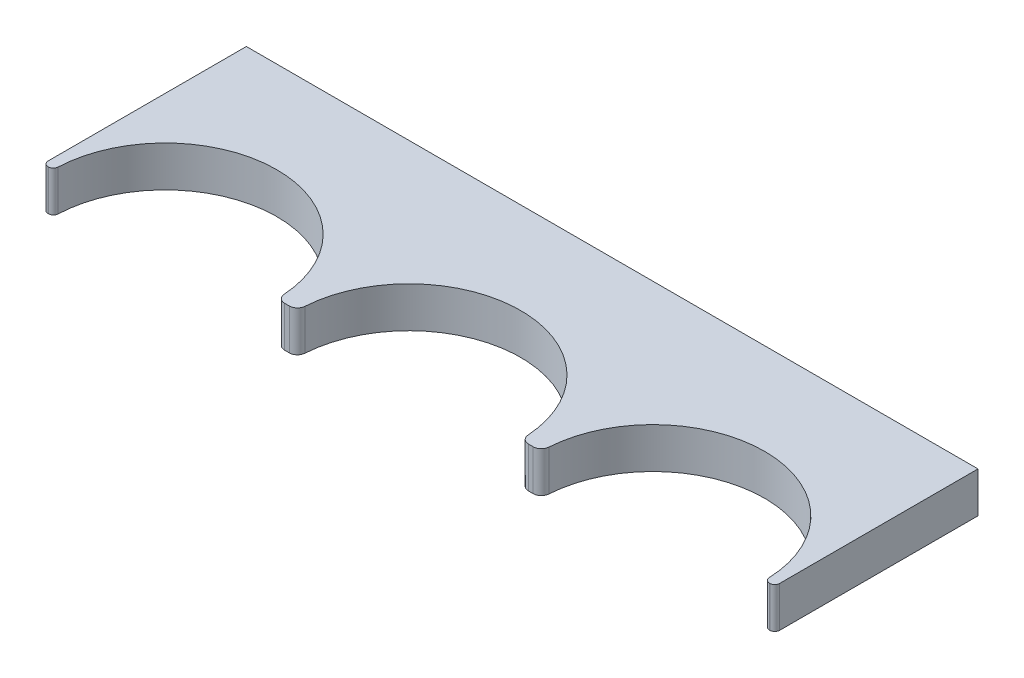
ISO-10303-21;
HEADER;
FILE_DESCRIPTION(('STEP AP214'),'2;1');
FILE_NAME('part.step','',(''),(''),'','','');
FILE_SCHEMA(('AUTOMOTIVE_DESIGN { 1 0 10303 214 1 1 1 1 }'));
ENDSEC;
DATA;
#1=APPLICATION_CONTEXT('core data for automotive mechanical design processes');
#2=APPLICATION_PROTOCOL_DEFINITION('international standard','automotive_design',2000,#1);
#3=PRODUCT_CONTEXT('',#1,'mechanical');
#4=PRODUCT('Part','Part','',(#3));
#5=PRODUCT_RELATED_PRODUCT_CATEGORY('part','',(#4));
#6=PRODUCT_DEFINITION_FORMATION('','',#4);
#7=PRODUCT_DEFINITION_CONTEXT('part definition',#1,'design');
#8=PRODUCT_DEFINITION('design','',#6,#7);
#9=PRODUCT_DEFINITION_SHAPE('','',#8);
#10=(LENGTH_UNIT() NAMED_UNIT(*) SI_UNIT(.MILLI.,.METRE.));
#11=(NAMED_UNIT(*) PLANE_ANGLE_UNIT() SI_UNIT($,.RADIAN.));
#12=(NAMED_UNIT(*) SI_UNIT($,.STERADIAN.) SOLID_ANGLE_UNIT());
#13=UNCERTAINTY_MEASURE_WITH_UNIT(LENGTH_MEASURE(1.E-05),#10,'distance_accuracy_value','');
#14=(GEOMETRIC_REPRESENTATION_CONTEXT(3) GLOBAL_UNCERTAINTY_ASSIGNED_CONTEXT((#13)) GLOBAL_UNIT_ASSIGNED_CONTEXT((#10,
#11,#12)) REPRESENTATION_CONTEXT('',''));
#15=CARTESIAN_POINT('',(0.,0.,0.));
#16=DIRECTION('',(0.,0.,1.));
#17=DIRECTION('',(1.,0.,0.));
#18=AXIS2_PLACEMENT_3D('',#15,#16,#17);
#19=CARTESIAN_POINT('',(-60.,10.,25.));
#20=DIRECTION('',(0.,-1.,0.));
#21=DIRECTION('',(0.,0.,-1.));
#22=AXIS2_PLACEMENT_3D('',#19,#20,#21);
#23=CYLINDRICAL_SURFACE('',#22,27.5);
#24=CARTESIAN_POINT('',(-60.,0.,25.));
#25=DIRECTION('',(0.,1.,0.));
#26=DIRECTION('',(0.,0.,1.));
#27=AXIS2_PLACEMENT_3D('',#24,#25,#26);
#28=CIRCLE('',#27,27.5);
#29=CARTESIAN_POINT('',(-32.5632730202753,0.,23.135593220339));
#30=VERTEX_POINT('',#29);
#31=CARTESIAN_POINT('',(-87.4759513150411,0.,23.8501742160279));
#32=VERTEX_POINT('',#31);
#33=EDGE_CURVE('E187',#30,#32,#28,.T.);
#34=ORIENTED_EDGE('',*,*,#33,.F.);
#35=DIRECTION('',(0.,-1.,0.));
#36=VECTOR('',#35,1.);
#37=CARTESIAN_POINT('',(-32.5632730202753,10.,23.135593220339));
#38=LINE('',#37,#36);
#39=CARTESIAN_POINT('',(-32.5632730202753,10.,23.135593220339));
#40=VERTEX_POINT('',#39);
#41=EDGE_CURVE('E11',#40,#30,#38,.T.);
#42=ORIENTED_EDGE('',*,*,#41,.F.);
#43=CARTESIAN_POINT('',(-60.,10.,25.));
#44=DIRECTION('',(0.,1.,0.));
#45=DIRECTION('',(0.,0.,1.));
#46=AXIS2_PLACEMENT_3D('',#43,#44,#45);
#47=CIRCLE('',#46,27.5);
#48=CARTESIAN_POINT('',(-87.4759513150411,10.,23.8501742160279));
#49=VERTEX_POINT('',#48);
#50=EDGE_CURVE('E235',#40,#49,#47,.T.);
#51=ORIENTED_EDGE('',*,*,#50,.T.);
#52=DIRECTION('',(0.,-1.,0.));
#53=VECTOR('',#52,1.);
#54=CARTESIAN_POINT('',(-87.4759513150411,10.,23.8501742160279));
#55=LINE('',#54,#53);
#56=EDGE_CURVE('E114',#49,#32,#55,.T.);
#57=ORIENTED_EDGE('',*,*,#56,.T.);
#58=EDGE_LOOP('',(#34,#42,#51,#57));
#59=FACE_BOUND('',#58,.T.);
#60=ADVANCED_FACE('F34',(#59),#23,.F.);
#61=CARTESIAN_POINT('',(-30.5678746944771,10.,23.));
#62=DIRECTION('',(0.,-1.,0.));
#63=DIRECTION('',(0.,0.,-1.));
#64=AXIS2_PLACEMENT_3D('',#61,#62,#63);
#65=CYLINDRICAL_SURFACE('',#64,2.);
#66=CARTESIAN_POINT('',(-30.5678746944771,0.,23.));
#67=DIRECTION('',(0.,1.,0.));
#68=DIRECTION('',(0.,0.,1.));
#69=AXIS2_PLACEMENT_3D('',#66,#67,#68);
#70=CIRCLE('',#69,2.);
#71=CARTESIAN_POINT('',(-30.5678746944771,0.,25.));
#72=VERTEX_POINT('',#71);
#73=EDGE_CURVE('E190',#30,#72,#70,.T.);
#74=ORIENTED_EDGE('',*,*,#73,.T.);
#75=DIRECTION('',(0.,-1.,0.));
#76=VECTOR('',#75,1.);
#77=CARTESIAN_POINT('',(-30.5678746944771,10.,25.));
#78=LINE('',#77,#76);
#79=CARTESIAN_POINT('',(-30.5678746944771,10.,25.));
#80=VERTEX_POINT('',#79);
#81=EDGE_CURVE('E42',#80,#72,#78,.T.);
#82=ORIENTED_EDGE('',*,*,#81,.F.);
#83=CARTESIAN_POINT('',(-30.5678746944771,10.,23.));
#84=DIRECTION('',(0.,1.,0.));
#85=DIRECTION('',(0.,0.,1.));
#86=AXIS2_PLACEMENT_3D('',#83,#84,#85);
#87=CIRCLE('',#86,2.);
#88=EDGE_CURVE('E288',#40,#80,#87,.T.);
#89=ORIENTED_EDGE('',*,*,#88,.F.);
#90=ORIENTED_EDGE('',*,*,#41,.T.);
#91=EDGE_LOOP('',(#74,#82,#89,#90));
#92=FACE_BOUND('',#91,.T.);
#93=ADVANCED_FACE('F273',(#92),#65,.T.);
#94=CARTESIAN_POINT('',(0.,10.,25.));
#95=DIRECTION('',(0.,0.,1.));
#96=DIRECTION('',(1.,0.,0.));
#97=AXIS2_PLACEMENT_3D('',#94,#95,#96);
#98=PLANE('',#97);
#99=DIRECTION('',(-1.,0.,0.));
#100=VECTOR('',#99,1.);
#101=CARTESIAN_POINT('',(0.,0.,25.));
#102=LINE('',#101,#100);
#103=CARTESIAN_POINT('',(-29.4321253055229,0.,25.));
#104=VERTEX_POINT('',#103);
#105=EDGE_CURVE('E193',#104,#72,#102,.T.);
#106=ORIENTED_EDGE('',*,*,#105,.F.);
#107=DIRECTION('',(0.,-1.,0.));
#108=VECTOR('',#107,1.);
#109=CARTESIAN_POINT('',(-29.4321253055229,10.,25.));
#110=LINE('',#109,#108);
#111=CARTESIAN_POINT('',(-29.4321253055229,10.,25.));
#112=VERTEX_POINT('',#111);
#113=EDGE_CURVE('E263',#112,#104,#110,.T.);
#114=ORIENTED_EDGE('',*,*,#113,.F.);
#115=DIRECTION('',(-1.,0.,0.));
#116=VECTOR('',#115,1.);
#117=CARTESIAN_POINT('',(0.,10.,25.));
#118=LINE('',#117,#116);
#119=EDGE_CURVE('E270',#112,#80,#118,.T.);
#120=ORIENTED_EDGE('',*,*,#119,.T.);
#121=ORIENTED_EDGE('',*,*,#81,.T.);
#122=EDGE_LOOP('',(#106,#114,#120,#121));
#123=FACE_BOUND('',#122,.T.);
#124=ADVANCED_FACE('F268',(#123),#98,.T.);
#125=CARTESIAN_POINT('',(-29.4321253055229,10.,23.));
#126=DIRECTION('',(0.,-1.,0.));
#127=DIRECTION('',(0.,0.,-1.));
#128=AXIS2_PLACEMENT_3D('',#125,#126,#127);
#129=CYLINDRICAL_SURFACE('',#128,2.);
#130=CARTESIAN_POINT('',(-29.4321253055229,0.,23.));
#131=DIRECTION('',(0.,1.,0.));
#132=DIRECTION('',(0.,0.,1.));
#133=AXIS2_PLACEMENT_3D('',#130,#131,#132);
#134=CIRCLE('',#133,2.);
#135=CARTESIAN_POINT('',(-27.4367269797247,0.,23.135593220339));
#136=VERTEX_POINT('',#135);
#137=EDGE_CURVE('E196',#104,#136,#134,.T.);
#138=ORIENTED_EDGE('',*,*,#137,.T.);
#139=DIRECTION('',(0.,-1.,0.));
#140=VECTOR('',#139,1.);
#141=CARTESIAN_POINT('',(-27.4367269797247,10.,23.135593220339));
#142=LINE('',#141,#140);
#143=CARTESIAN_POINT('',(-27.4367269797247,10.,23.135593220339));
#144=VERTEX_POINT('',#143);
#145=EDGE_CURVE('E261',#144,#136,#142,.T.);
#146=ORIENTED_EDGE('',*,*,#145,.F.);
#147=CARTESIAN_POINT('',(-29.4321253055229,10.,23.));
#148=DIRECTION('',(0.,1.,0.));
#149=DIRECTION('',(0.,0.,1.));
#150=AXIS2_PLACEMENT_3D('',#147,#148,#149);
#151=CIRCLE('',#150,2.);
#152=EDGE_CURVE('E284',#112,#144,#151,.T.);
#153=ORIENTED_EDGE('',*,*,#152,.F.);
#154=ORIENTED_EDGE('',*,*,#113,.T.);
#155=EDGE_LOOP('',(#138,#146,#153,#154));
#156=FACE_BOUND('',#155,.T.);
#157=ADVANCED_FACE('F281',(#156),#129,.T.);
#158=CARTESIAN_POINT('',(0.,10.,25.));
#159=DIRECTION('',(0.,-1.,0.));
#160=DIRECTION('',(0.,0.,-1.));
#161=AXIS2_PLACEMENT_3D('',#158,#159,#160);
#162=CYLINDRICAL_SURFACE('',#161,27.5);
#163=CARTESIAN_POINT('',(0.,0.,25.));
#164=DIRECTION('',(0.,1.,0.));
#165=DIRECTION('',(0.,0.,1.));
#166=AXIS2_PLACEMENT_3D('',#163,#164,#165);
#167=CIRCLE('',#166,27.5);
#168=CARTESIAN_POINT('',(27.4367269797247,0.,23.135593220339));
#169=VERTEX_POINT('',#168);
#170=EDGE_CURVE('E199',#169,#136,#167,.T.);
#171=ORIENTED_EDGE('',*,*,#170,.F.);
#172=DIRECTION('',(0.,-1.,0.));
#173=VECTOR('',#172,1.);
#174=CARTESIAN_POINT('',(27.4367269797247,10.,23.135593220339));
#175=LINE('',#174,#173);
#176=CARTESIAN_POINT('',(27.4367269797247,10.,23.135593220339));
#177=VERTEX_POINT('',#176);
#178=EDGE_CURVE('E259',#177,#169,#175,.T.);
#179=ORIENTED_EDGE('',*,*,#178,.F.);
#180=CARTESIAN_POINT('',(0.,10.,25.));
#181=DIRECTION('',(0.,1.,0.));
#182=DIRECTION('',(0.,0.,1.));
#183=AXIS2_PLACEMENT_3D('',#180,#181,#182);
#184=CIRCLE('',#183,27.5);
#185=EDGE_CURVE('E286',#177,#144,#184,.T.);
#186=ORIENTED_EDGE('',*,*,#185,.T.);
#187=ORIENTED_EDGE('',*,*,#145,.T.);
#188=EDGE_LOOP('',(#171,#179,#186,#187));
#189=FACE_BOUND('',#188,.T.);
#190=ADVANCED_FACE('F332',(#189),#162,.F.);
#191=CARTESIAN_POINT('',(29.4321253055229,10.,23.));
#192=DIRECTION('',(0.,-1.,0.));
#193=DIRECTION('',(0.,0.,-1.));
#194=AXIS2_PLACEMENT_3D('',#191,#192,#193);
#195=CYLINDRICAL_SURFACE('',#194,2.);
#196=CARTESIAN_POINT('',(29.4321253055229,0.,23.));
#197=DIRECTION('',(0.,1.,0.));
#198=DIRECTION('',(0.,0.,1.));
#199=AXIS2_PLACEMENT_3D('',#196,#197,#198);
#200=CIRCLE('',#199,2.);
#201=CARTESIAN_POINT('',(29.4321253055229,0.,25.));
#202=VERTEX_POINT('',#201);
#203=EDGE_CURVE('E202',#169,#202,#200,.T.);
#204=ORIENTED_EDGE('',*,*,#203,.T.);
#205=DIRECTION('',(0.,-1.,0.));
#206=VECTOR('',#205,1.);
#207=CARTESIAN_POINT('',(29.4321253055229,10.,25.));
#208=LINE('',#207,#206);
#209=CARTESIAN_POINT('',(29.4321253055229,10.,25.));
#210=VERTEX_POINT('',#209);
#211=EDGE_CURVE('E257',#210,#202,#208,.T.);
#212=ORIENTED_EDGE('',*,*,#211,.F.);
#213=CARTESIAN_POINT('',(29.4321253055229,10.,23.));
#214=DIRECTION('',(0.,1.,0.));
#215=DIRECTION('',(0.,0.,1.));
#216=AXIS2_PLACEMENT_3D('',#213,#214,#215);
#217=CIRCLE('',#216,2.);
#218=EDGE_CURVE('E294',#177,#210,#217,.T.);
#219=ORIENTED_EDGE('',*,*,#218,.F.);
#220=ORIENTED_EDGE('',*,*,#178,.T.);
#221=EDGE_LOOP('',(#204,#212,#219,#220));
#222=FACE_BOUND('',#221,.T.);
#223=ADVANCED_FACE('F335',(#222),#195,.T.);
#224=CARTESIAN_POINT('',(0.,10.,25.));
#225=DIRECTION('',(0.,0.,1.));
#226=DIRECTION('',(1.,0.,0.));
#227=AXIS2_PLACEMENT_3D('',#224,#225,#226);
#228=PLANE('',#227);
#229=DIRECTION('',(-1.,0.,0.));
#230=VECTOR('',#229,1.);
#231=CARTESIAN_POINT('',(0.,0.,25.));
#232=LINE('',#231,#230);
#233=CARTESIAN_POINT('',(30.5678746944771,0.,25.));
#234=VERTEX_POINT('',#233);
#235=EDGE_CURVE('E205',#234,#202,#232,.T.);
#236=ORIENTED_EDGE('',*,*,#235,.F.);
#237=DIRECTION('',(0.,-1.,0.));
#238=VECTOR('',#237,1.);
#239=CARTESIAN_POINT('',(30.5678746944771,10.,25.));
#240=LINE('',#239,#238);
#241=CARTESIAN_POINT('',(30.5678746944771,10.,25.));
#242=VERTEX_POINT('',#241);
#243=EDGE_CURVE('E255',#242,#234,#240,.T.);
#244=ORIENTED_EDGE('',*,*,#243,.F.);
#245=DIRECTION('',(-1.,0.,0.));
#246=VECTOR('',#245,1.);
#247=CARTESIAN_POINT('',(0.,10.,25.));
#248=LINE('',#247,#246);
#249=EDGE_CURVE('E296',#242,#210,#248,.T.);
#250=ORIENTED_EDGE('',*,*,#249,.T.);
#251=ORIENTED_EDGE('',*,*,#211,.T.);
#252=EDGE_LOOP('',(#236,#244,#250,#251));
#253=FACE_BOUND('',#252,.T.);
#254=ADVANCED_FACE('F339',(#253),#228,.T.);
#255=CARTESIAN_POINT('',(30.5678746944771,10.,23.));
#256=DIRECTION('',(0.,-1.,0.));
#257=DIRECTION('',(0.,0.,-1.));
#258=AXIS2_PLACEMENT_3D('',#255,#256,#257);
#259=CYLINDRICAL_SURFACE('',#258,2.);
#260=CARTESIAN_POINT('',(30.5678746944771,0.,23.));
#261=DIRECTION('',(0.,1.,0.));
#262=DIRECTION('',(0.,0.,1.));
#263=AXIS2_PLACEMENT_3D('',#260,#261,#262);
#264=CIRCLE('',#263,2.);
#265=CARTESIAN_POINT('',(32.5632730202753,0.,23.135593220339));
#266=VERTEX_POINT('',#265);
#267=EDGE_CURVE('E208',#234,#266,#264,.T.);
#268=ORIENTED_EDGE('',*,*,#267,.T.);
#269=DIRECTION('',(0.,-1.,0.));
#270=VECTOR('',#269,1.);
#271=CARTESIAN_POINT('',(32.5632730202753,10.,23.135593220339));
#272=LINE('',#271,#270);
#273=CARTESIAN_POINT('',(32.5632730202753,10.,23.135593220339));
#274=VERTEX_POINT('',#273);
#275=EDGE_CURVE('E253',#274,#266,#272,.T.);
#276=ORIENTED_EDGE('',*,*,#275,.F.);
#277=CARTESIAN_POINT('',(30.5678746944771,10.,23.));
#278=DIRECTION('',(0.,1.,0.));
#279=DIRECTION('',(0.,0.,1.));
#280=AXIS2_PLACEMENT_3D('',#277,#278,#279);
#281=CIRCLE('',#280,2.);
#282=EDGE_CURVE('E299',#242,#274,#281,.T.);
#283=ORIENTED_EDGE('',*,*,#282,.F.);
#284=ORIENTED_EDGE('',*,*,#243,.T.);
#285=EDGE_LOOP('',(#268,#276,#283,#284));
#286=FACE_BOUND('',#285,.T.);
#287=ADVANCED_FACE('F343',(#286),#259,.T.);
#288=CARTESIAN_POINT('',(60.,10.,25.));
#289=DIRECTION('',(0.,-1.,0.));
#290=DIRECTION('',(0.,0.,-1.));
#291=AXIS2_PLACEMENT_3D('',#288,#289,#290);
#292=CYLINDRICAL_SURFACE('',#291,27.5);
#293=CARTESIAN_POINT('',(60.,0.,25.));
#294=DIRECTION('',(0.,1.,0.));
#295=DIRECTION('',(0.,0.,1.));
#296=AXIS2_PLACEMENT_3D('',#293,#294,#295);
#297=CIRCLE('',#296,27.5);
#298=CARTESIAN_POINT('',(87.4759513150412,0.,23.8501742160279));
#299=VERTEX_POINT('',#298);
#300=EDGE_CURVE('E211',#299,#266,#297,.T.);
#301=ORIENTED_EDGE('',*,*,#300,.F.);
#302=DIRECTION('',(0.,-1.,0.));
#303=VECTOR('',#302,1.);
#304=CARTESIAN_POINT('',(87.4759513150412,10.,23.8501742160279));
#305=LINE('',#304,#303);
#306=CARTESIAN_POINT('',(87.4759513150412,10.,23.8501742160279));
#307=VERTEX_POINT('',#306);
#308=EDGE_CURVE('E251',#307,#299,#305,.T.);
#309=ORIENTED_EDGE('',*,*,#308,.F.);
#310=CARTESIAN_POINT('',(60.,10.,25.));
#311=DIRECTION('',(0.,1.,0.));
#312=DIRECTION('',(0.,0.,1.));
#313=AXIS2_PLACEMENT_3D('',#310,#311,#312);
#314=CIRCLE('',#313,27.5);
#315=EDGE_CURVE('E301',#307,#274,#314,.T.);
#316=ORIENTED_EDGE('',*,*,#315,.T.);
#317=ORIENTED_EDGE('',*,*,#275,.T.);
#318=EDGE_LOOP('',(#301,#309,#316,#317));
#319=FACE_BOUND('',#318,.T.);
#320=ADVANCED_FACE('F347',(#319),#292,.F.);
#321=CARTESIAN_POINT('',(88.6749019178793,10.,23.8));
#322=DIRECTION('',(0.,-1.,0.));
#323=DIRECTION('',(0.,0.,-1.));
#324=AXIS2_PLACEMENT_3D('',#321,#322,#323);
#325=CYLINDRICAL_SURFACE('',#324,1.2);
#326=CARTESIAN_POINT('',(88.6749019178793,0.,23.8));
#327=DIRECTION('',(0.,1.,0.));
#328=DIRECTION('',(0.,0.,1.));
#329=AXIS2_PLACEMENT_3D('',#326,#327,#328);
#330=CIRCLE('',#329,1.2);
#331=CARTESIAN_POINT('',(88.6749019178793,0.,25.));
#332=VERTEX_POINT('',#331);
#333=EDGE_CURVE('E214',#332,#299,#330,.F.);
#334=ORIENTED_EDGE('',*,*,#333,.F.);
#335=DIRECTION('',(0.,-1.,0.));
#336=VECTOR('',#335,1.);
#337=CARTESIAN_POINT('',(88.6749019178793,10.,25.));
#338=LINE('',#337,#336);
#339=CARTESIAN_POINT('',(88.6749019178793,10.,25.));
#340=VERTEX_POINT('',#339);
#341=EDGE_CURVE('E249',#340,#332,#338,.T.);
#342=ORIENTED_EDGE('',*,*,#341,.F.);
#343=CARTESIAN_POINT('',(88.6749019178793,10.,23.8));
#344=DIRECTION('',(0.,1.,0.));
#345=DIRECTION('',(0.,0.,1.));
#346=AXIS2_PLACEMENT_3D('',#343,#344,#345);
#347=CIRCLE('',#346,1.2);
#348=EDGE_CURVE('E304',#340,#307,#347,.F.);
#349=ORIENTED_EDGE('',*,*,#348,.T.);
#350=ORIENTED_EDGE('',*,*,#308,.T.);
#351=EDGE_LOOP('',(#334,#342,#349,#350));
#352=FACE_BOUND('',#351,.T.);
#353=ADVANCED_FACE('F351',(#352),#325,.T.);
#354=CARTESIAN_POINT('',(0.,10.,25.));
#355=DIRECTION('',(0.,0.,1.));
#356=DIRECTION('',(1.,0.,0.));
#357=AXIS2_PLACEMENT_3D('',#354,#355,#356);
#358=PLANE('',#357);
#359=DIRECTION('',(-1.,0.,0.));
#360=VECTOR('',#359,1.);
#361=CARTESIAN_POINT('',(0.,0.,25.));
#362=LINE('',#361,#360);
#363=CARTESIAN_POINT('',(88.8,0.,25.));
#364=VERTEX_POINT('',#363);
#365=EDGE_CURVE('E217',#364,#332,#362,.T.);
#366=ORIENTED_EDGE('',*,*,#365,.F.);
#367=DIRECTION('',(0.,-1.,0.));
#368=VECTOR('',#367,1.);
#369=CARTESIAN_POINT('',(88.8,10.,25.));
#370=LINE('',#369,#368);
#371=CARTESIAN_POINT('',(88.8,10.,25.));
#372=VERTEX_POINT('',#371);
#373=EDGE_CURVE('E247',#372,#364,#370,.T.);
#374=ORIENTED_EDGE('',*,*,#373,.F.);
#375=DIRECTION('',(-1.,0.,0.));
#376=VECTOR('',#375,1.);
#377=CARTESIAN_POINT('',(0.,10.,25.));
#378=LINE('',#377,#376);
#379=EDGE_CURVE('E307',#372,#340,#378,.T.);
#380=ORIENTED_EDGE('',*,*,#379,.T.);
#381=ORIENTED_EDGE('',*,*,#341,.T.);
#382=EDGE_LOOP('',(#366,#374,#380,#381));
#383=FACE_BOUND('',#382,.T.);
#384=ADVANCED_FACE('F355',(#383),#358,.T.);
#385=CARTESIAN_POINT('',(88.8,10.,23.8));
#386=DIRECTION('',(0.,-1.,0.));
#387=DIRECTION('',(0.,0.,-1.));
#388=AXIS2_PLACEMENT_3D('',#385,#386,#387);
#389=CYLINDRICAL_SURFACE('',#388,1.2);
#390=CARTESIAN_POINT('',(88.8,0.,23.8));
#391=DIRECTION('',(0.,1.,0.));
#392=DIRECTION('',(0.,0.,1.));
#393=AXIS2_PLACEMENT_3D('',#390,#391,#392);
#394=CIRCLE('',#393,1.2);
#395=CARTESIAN_POINT('',(90.,0.,23.8));
#396=VERTEX_POINT('',#395);
#397=EDGE_CURVE('E220',#364,#396,#394,.T.);
#398=ORIENTED_EDGE('',*,*,#397,.T.);
#399=DIRECTION('',(0.,-1.,0.));
#400=VECTOR('',#399,1.);
#401=CARTESIAN_POINT('',(90.,10.,23.8));
#402=LINE('',#401,#400);
#403=CARTESIAN_POINT('',(90.,10.,23.8));
#404=VERTEX_POINT('',#403);
#405=EDGE_CURVE('E244',#404,#396,#402,.T.);
#406=ORIENTED_EDGE('',*,*,#405,.F.);
#407=CARTESIAN_POINT('',(88.8,10.,23.8));
#408=DIRECTION('',(0.,1.,0.));
#409=DIRECTION('',(0.,0.,1.));
#410=AXIS2_PLACEMENT_3D('',#407,#408,#409);
#411=CIRCLE('',#410,1.2);
#412=EDGE_CURVE('E310',#372,#404,#411,.T.);
#413=ORIENTED_EDGE('',*,*,#412,.F.);
#414=ORIENTED_EDGE('',*,*,#373,.T.);
#415=EDGE_LOOP('',(#398,#406,#413,#414));
#416=FACE_BOUND('',#415,.T.);
#417=ADVANCED_FACE('F359',(#416),#389,.T.);
#418=CARTESIAN_POINT('',(90.,10.,0.));
#419=DIRECTION('',(-1.,0.,0.));
#420=DIRECTION('',(0.,0.,1.));
#421=AXIS2_PLACEMENT_3D('',#418,#419,#420);
#422=PLANE('',#421);
#423=DIRECTION('',(0.,0.,-1.));
#424=VECTOR('',#423,1.);
#425=CARTESIAN_POINT('',(90.,0.,0.));
#426=LINE('',#425,#424);
#427=CARTESIAN_POINT('',(90.,0.,-25.));
#428=VERTEX_POINT('',#427);
#429=EDGE_CURVE('E222',#396,#428,#426,.T.);
#430=ORIENTED_EDGE('',*,*,#429,.T.);
#431=DIRECTION('',(0.,-1.,0.));
#432=VECTOR('',#431,1.);
#433=CARTESIAN_POINT('',(90.,10.,-25.));
#434=LINE('',#433,#432);
#435=CARTESIAN_POINT('',(90.,10.,-25.));
#436=VERTEX_POINT('',#435);
#437=EDGE_CURVE('E241',#436,#428,#434,.T.);
#438=ORIENTED_EDGE('',*,*,#437,.F.);
#439=DIRECTION('',(0.,0.,-1.));
#440=VECTOR('',#439,1.);
#441=CARTESIAN_POINT('',(90.,10.,0.));
#442=LINE('',#441,#440);
#443=EDGE_CURVE('E312',#404,#436,#442,.T.);
#444=ORIENTED_EDGE('',*,*,#443,.F.);
#445=ORIENTED_EDGE('',*,*,#405,.T.);
#446=EDGE_LOOP('',(#430,#438,#444,#445));
#447=FACE_BOUND('',#446,.T.);
#448=ADVANCED_FACE('F363',(#447),#422,.F.);
#449=CARTESIAN_POINT('',(0.,10.,-25.));
#450=DIRECTION('',(0.,0.,1.));
#451=DIRECTION('',(1.,0.,0.));
#452=AXIS2_PLACEMENT_3D('',#449,#450,#451);
#453=PLANE('',#452);
#454=DIRECTION('',(-1.,0.,0.));
#455=VECTOR('',#454,1.);
#456=CARTESIAN_POINT('',(0.,0.,-25.));
#457=LINE('',#456,#455);
#458=CARTESIAN_POINT('',(-90.,0.,-25.));
#459=VERTEX_POINT('',#458);
#460=EDGE_CURVE('E224',#428,#459,#457,.T.);
#461=ORIENTED_EDGE('',*,*,#460,.T.);
#462=DIRECTION('',(0.,-1.,0.));
#463=VECTOR('',#462,1.);
#464=CARTESIAN_POINT('',(-90.,10.,-25.));
#465=LINE('',#464,#463);
#466=CARTESIAN_POINT('',(-90.,10.,-25.));
#467=VERTEX_POINT('',#466);
#468=EDGE_CURVE('E239',#467,#459,#465,.T.);
#469=ORIENTED_EDGE('',*,*,#468,.F.);
#470=DIRECTION('',(-1.,0.,0.));
#471=VECTOR('',#470,1.);
#472=CARTESIAN_POINT('',(0.,10.,-25.));
#473=LINE('',#472,#471);
#474=EDGE_CURVE('E314',#436,#467,#473,.T.);
#475=ORIENTED_EDGE('',*,*,#474,.F.);
#476=ORIENTED_EDGE('',*,*,#437,.T.);
#477=EDGE_LOOP('',(#461,#469,#475,#476));
#478=FACE_BOUND('',#477,.T.);
#479=ADVANCED_FACE('F367',(#478),#453,.F.);
#480=CARTESIAN_POINT('',(-90.,10.,0.));
#481=DIRECTION('',(-1.,0.,0.));
#482=DIRECTION('',(0.,0.,1.));
#483=AXIS2_PLACEMENT_3D('',#480,#481,#482);
#484=PLANE('',#483);
#485=DIRECTION('',(0.,0.,-1.));
#486=VECTOR('',#485,1.);
#487=CARTESIAN_POINT('',(-90.,0.,0.));
#488=LINE('',#487,#486);
#489=CARTESIAN_POINT('',(-90.,0.,23.8));
#490=VERTEX_POINT('',#489);
#491=EDGE_CURVE('E227',#490,#459,#488,.T.);
#492=ORIENTED_EDGE('',*,*,#491,.F.);
#493=DIRECTION('',(0.,-1.,0.));
#494=VECTOR('',#493,1.);
#495=CARTESIAN_POINT('',(-90.,10.,23.8));
#496=LINE('',#495,#494);
#497=CARTESIAN_POINT('',(-90.,10.,23.8));
#498=VERTEX_POINT('',#497);
#499=EDGE_CURVE('E174',#498,#490,#496,.T.);
#500=ORIENTED_EDGE('',*,*,#499,.F.);
#501=DIRECTION('',(0.,0.,-1.));
#502=VECTOR('',#501,1.);
#503=CARTESIAN_POINT('',(-90.,10.,0.));
#504=LINE('',#503,#502);
#505=EDGE_CURVE('E180',#498,#467,#504,.T.);
#506=ORIENTED_EDGE('',*,*,#505,.T.);
#507=ORIENTED_EDGE('',*,*,#468,.T.);
#508=EDGE_LOOP('',(#492,#500,#506,#507));
#509=FACE_BOUND('',#508,.T.);
#510=ADVANCED_FACE('F317',(#509),#484,.T.);
#511=CARTESIAN_POINT('',(-88.8,10.,23.8));
#512=DIRECTION('',(0.,-1.,0.));
#513=DIRECTION('',(0.,0.,-1.));
#514=AXIS2_PLACEMENT_3D('',#511,#512,#513);
#515=CYLINDRICAL_SURFACE('',#514,1.2);
#516=CARTESIAN_POINT('',(-88.8,0.,23.8));
#517=DIRECTION('',(0.,1.,0.));
#518=DIRECTION('',(0.,0.,1.));
#519=AXIS2_PLACEMENT_3D('',#516,#517,#518);
#520=CIRCLE('',#519,1.2);
#521=CARTESIAN_POINT('',(-88.8,0.,25.));
#522=VERTEX_POINT('',#521);
#523=EDGE_CURVE('E169',#522,#490,#520,.F.);
#524=ORIENTED_EDGE('',*,*,#523,.F.);
#525=DIRECTION('',(0.,-1.,0.));
#526=VECTOR('',#525,1.);
#527=CARTESIAN_POINT('',(-88.8,10.,25.));
#528=LINE('',#527,#526);
#529=CARTESIAN_POINT('',(-88.8,10.,25.));
#530=VERTEX_POINT('',#529);
#531=EDGE_CURVE('E164',#530,#522,#528,.T.);
#532=ORIENTED_EDGE('',*,*,#531,.F.);
#533=CARTESIAN_POINT('',(-88.8,10.,23.8));
#534=DIRECTION('',(0.,1.,0.));
#535=DIRECTION('',(0.,0.,1.));
#536=AXIS2_PLACEMENT_3D('',#533,#534,#535);
#537=CIRCLE('',#536,1.2);
#538=EDGE_CURVE('E167',#530,#498,#537,.F.);
#539=ORIENTED_EDGE('',*,*,#538,.T.);
#540=ORIENTED_EDGE('',*,*,#499,.T.);
#541=EDGE_LOOP('',(#524,#532,#539,#540));
#542=FACE_BOUND('',#541,.T.);
#543=ADVANCED_FACE('F166',(#542),#515,.T.);
#544=CARTESIAN_POINT('',(0.,10.,25.));
#545=DIRECTION('',(0.,0.,1.));
#546=DIRECTION('',(1.,0.,0.));
#547=AXIS2_PLACEMENT_3D('',#544,#545,#546);
#548=PLANE('',#547);
#549=DIRECTION('',(-1.,0.,0.));
#550=VECTOR('',#549,1.);
#551=CARTESIAN_POINT('',(0.,0.,25.));
#552=LINE('',#551,#550);
#553=CARTESIAN_POINT('',(-88.6749019178793,0.,25.));
#554=VERTEX_POINT('',#553);
#555=EDGE_CURVE('E231',#554,#522,#552,.T.);
#556=ORIENTED_EDGE('',*,*,#555,.F.);
#557=DIRECTION('',(0.,-1.,0.));
#558=VECTOR('',#557,1.);
#559=CARTESIAN_POINT('',(-88.6749019178793,10.,25.));
#560=LINE('',#559,#558);
#561=CARTESIAN_POINT('',(-88.6749019178793,10.,25.));
#562=VERTEX_POINT('',#561);
#563=EDGE_CURVE('E107',#562,#554,#560,.T.);
#564=ORIENTED_EDGE('',*,*,#563,.F.);
#565=DIRECTION('',(-1.,0.,0.));
#566=VECTOR('',#565,1.);
#567=CARTESIAN_POINT('',(0.,10.,25.));
#568=LINE('',#567,#566);
#569=EDGE_CURVE('E178',#562,#530,#568,.T.);
#570=ORIENTED_EDGE('',*,*,#569,.T.);
#571=ORIENTED_EDGE('',*,*,#531,.T.);
#572=EDGE_LOOP('',(#556,#564,#570,#571));
#573=FACE_BOUND('',#572,.T.);
#574=ADVANCED_FACE('F182',(#573),#548,.T.);
#575=CARTESIAN_POINT('',(-88.6749019178793,10.,23.8));
#576=DIRECTION('',(0.,-1.,0.));
#577=DIRECTION('',(0.,0.,-1.));
#578=AXIS2_PLACEMENT_3D('',#575,#576,#577);
#579=CYLINDRICAL_SURFACE('',#578,1.2);
#580=CARTESIAN_POINT('',(-88.6749019178793,0.,23.8));
#581=DIRECTION('',(0.,1.,0.));
#582=DIRECTION('',(0.,0.,1.));
#583=AXIS2_PLACEMENT_3D('',#580,#581,#582);
#584=CIRCLE('',#583,1.2);
#585=EDGE_CURVE('E233',#554,#32,#584,.T.);
#586=ORIENTED_EDGE('',*,*,#585,.T.);
#587=ORIENTED_EDGE('',*,*,#56,.F.);
#588=CARTESIAN_POINT('',(-88.6749019178793,10.,23.8));
#589=DIRECTION('',(0.,1.,0.));
#590=DIRECTION('',(0.,0.,1.));
#591=AXIS2_PLACEMENT_3D('',#588,#589,#590);
#592=CIRCLE('',#591,1.2);
#593=EDGE_CURVE('E50',#562,#49,#592,.T.);
#594=ORIENTED_EDGE('',*,*,#593,.F.);
#595=ORIENTED_EDGE('',*,*,#563,.T.);
#596=EDGE_LOOP('',(#586,#587,#594,#595));
#597=FACE_BOUND('',#596,.T.);
#598=ADVANCED_FACE('F320',(#597),#579,.T.);
#599=CARTESIAN_POINT('',(0.,10.,0.));
#600=DIRECTION('',(0.,1.,0.));
#601=DIRECTION('',(0.,0.,1.));
#602=AXIS2_PLACEMENT_3D('',#599,#600,#601);
#603=PLANE('',#602);
#604=ORIENTED_EDGE('',*,*,#50,.F.);
#605=ORIENTED_EDGE('',*,*,#88,.T.);
#606=ORIENTED_EDGE('',*,*,#119,.F.);
#607=ORIENTED_EDGE('',*,*,#152,.T.);
#608=ORIENTED_EDGE('',*,*,#185,.F.);
#609=ORIENTED_EDGE('',*,*,#218,.T.);
#610=ORIENTED_EDGE('',*,*,#249,.F.);
#611=ORIENTED_EDGE('',*,*,#282,.T.);
#612=ORIENTED_EDGE('',*,*,#315,.F.);
#613=ORIENTED_EDGE('',*,*,#348,.F.);
#614=ORIENTED_EDGE('',*,*,#379,.F.);
#615=ORIENTED_EDGE('',*,*,#412,.T.);
#616=ORIENTED_EDGE('',*,*,#443,.T.);
#617=ORIENTED_EDGE('',*,*,#474,.T.);
#618=ORIENTED_EDGE('',*,*,#505,.F.);
#619=ORIENTED_EDGE('',*,*,#538,.F.);
#620=ORIENTED_EDGE('',*,*,#569,.F.);
#621=ORIENTED_EDGE('',*,*,#593,.T.);
#622=EDGE_LOOP('',(#604,#605,#606,#607,#608,#609,#610,#611,#612,#613,#614,#615,#616,#617,#618,
#619,#620,#621));
#623=FACE_BOUND('',#622,.T.);
#624=ADVANCED_FACE('F177',(#623),#603,.T.);
#625=CARTESIAN_POINT('',(0.,0.,0.));
#626=DIRECTION('',(0.,1.,0.));
#627=DIRECTION('',(0.,0.,1.));
#628=AXIS2_PLACEMENT_3D('',#625,#626,#627);
#629=PLANE('',#628);
#630=ORIENTED_EDGE('',*,*,#33,.T.);
#631=ORIENTED_EDGE('',*,*,#585,.F.);
#632=ORIENTED_EDGE('',*,*,#555,.T.);
#633=ORIENTED_EDGE('',*,*,#523,.T.);
#634=ORIENTED_EDGE('',*,*,#491,.T.);
#635=ORIENTED_EDGE('',*,*,#460,.F.);
#636=ORIENTED_EDGE('',*,*,#429,.F.);
#637=ORIENTED_EDGE('',*,*,#397,.F.);
#638=ORIENTED_EDGE('',*,*,#365,.T.);
#639=ORIENTED_EDGE('',*,*,#333,.T.);
#640=ORIENTED_EDGE('',*,*,#300,.T.);
#641=ORIENTED_EDGE('',*,*,#267,.F.);
#642=ORIENTED_EDGE('',*,*,#235,.T.);
#643=ORIENTED_EDGE('',*,*,#203,.F.);
#644=ORIENTED_EDGE('',*,*,#170,.T.);
#645=ORIENTED_EDGE('',*,*,#137,.F.);
#646=ORIENTED_EDGE('',*,*,#105,.T.);
#647=ORIENTED_EDGE('',*,*,#73,.F.);
#648=EDGE_LOOP('',(#630,#631,#632,#633,#634,#635,#636,#637,#638,#639,#640,#641,#642,#643,#644,
#645,#646,#647));
#649=FACE_BOUND('',#648,.T.);
#650=ADVANCED_FACE('F276',(#649),#629,.F.);
#651=CLOSED_SHELL('',(#60,#93,#124,#157,#190,#223,#254,#287,#320,#353,#384,#417,#448,#479,#510,
#543,#574,#598,#624,#650));
#652=MANIFOLD_SOLID_BREP('B2',#651);
#653=ADVANCED_BREP_SHAPE_REPRESENTATION('',(#18,#652),#14);
#654=SHAPE_DEFINITION_REPRESENTATION(#9,#653);
ENDSEC;
END-ISO-10303-21;
